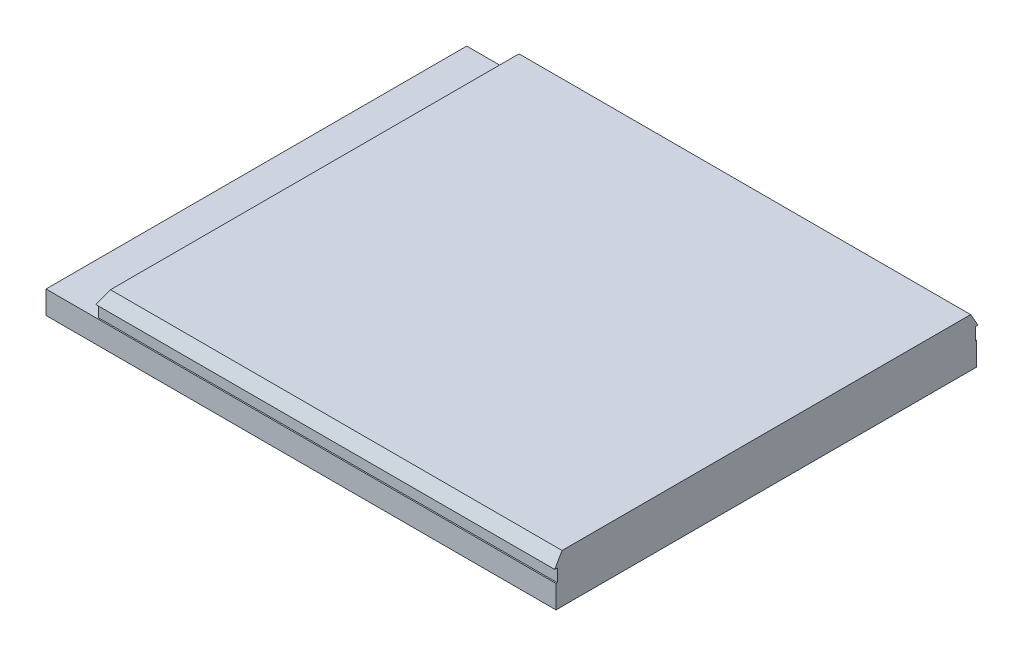
ISO-10303-21;
HEADER;
FILE_DESCRIPTION(('STEP AP214'),'2;1');
FILE_NAME('part.step','',(''),(''),'','','');
FILE_SCHEMA(('AUTOMOTIVE_DESIGN { 1 0 10303 214 1 1 1 1 }'));
ENDSEC;
DATA;
#1=APPLICATION_CONTEXT('core data for automotive mechanical design processes');
#2=APPLICATION_PROTOCOL_DEFINITION('international standard','automotive_design',2000,#1);
#3=PRODUCT_CONTEXT('',#1,'mechanical');
#4=PRODUCT('Part','Part','',(#3));
#5=PRODUCT_RELATED_PRODUCT_CATEGORY('part','',(#4));
#6=PRODUCT_DEFINITION_FORMATION('','',#4);
#7=PRODUCT_DEFINITION_CONTEXT('part definition',#1,'design');
#8=PRODUCT_DEFINITION('design','',#6,#7);
#9=PRODUCT_DEFINITION_SHAPE('','',#8);
#10=(LENGTH_UNIT() NAMED_UNIT(*) SI_UNIT(.MILLI.,.METRE.));
#11=(NAMED_UNIT(*) PLANE_ANGLE_UNIT() SI_UNIT($,.RADIAN.));
#12=(NAMED_UNIT(*) SI_UNIT($,.STERADIAN.) SOLID_ANGLE_UNIT());
#13=UNCERTAINTY_MEASURE_WITH_UNIT(LENGTH_MEASURE(1.E-05),#10,'distance_accuracy_value','');
#14=(GEOMETRIC_REPRESENTATION_CONTEXT(3) GLOBAL_UNCERTAINTY_ASSIGNED_CONTEXT((#13)) GLOBAL_UNIT_ASSIGNED_CONTEXT((#10,
#11,#12)) REPRESENTATION_CONTEXT('',''));
#15=CARTESIAN_POINT('',(0.,0.,0.));
#16=DIRECTION('',(0.,0.,1.));
#17=DIRECTION('',(1.,0.,0.));
#18=AXIS2_PLACEMENT_3D('',#15,#16,#17);
#19=CARTESIAN_POINT('',(-7.15383369720603,-16.2258305231151,4.44835605739227));
#20=DIRECTION('',(0.,1.,0.));
#21=DIRECTION('',(0.,0.,1.));
#22=AXIS2_PLACEMENT_3D('',#19,#20,#21);
#23=PLANE('',#22);
#24=DIRECTION('',(0.,0.,-1.));
#25=VECTOR('',#24,1.);
#26=CARTESIAN_POINT('',(-7.15383369720603,-16.2258305231151,25.1637386364569));
#27=LINE('',#26,#25);
#28=CARTESIAN_POINT('',(-7.15383369720603,-16.2258305231151,24.7971212155214));
#29=VERTEX_POINT('',#28);
#30=CARTESIAN_POINT('',(-7.15383369720603,-16.2258305231151,4.44835605739227));
#31=VERTEX_POINT('',#30);
#32=EDGE_CURVE('E221',#29,#31,#27,.T.);
#33=ORIENTED_EDGE('',*,*,#32,.T.);
#34=DIRECTION('',(-1.,0.,0.));
#35=VECTOR('',#34,1.);
#36=CARTESIAN_POINT('',(-30.013833697206,-16.2258305231151,4.44835605739227));
#37=LINE('',#36,#35);
#38=CARTESIAN_POINT('',(-29.6472162762706,-16.2258305231151,4.44835605739227));
#39=VERTEX_POINT('',#38);
#40=EDGE_CURVE('E187',#31,#39,#37,.T.);
#41=ORIENTED_EDGE('',*,*,#40,.T.);
#42=DIRECTION('',(0.,0.,1.));
#43=VECTOR('',#42,1.);
#44=CARTESIAN_POINT('',(-29.6472162762706,-16.2258305231151,25.1637386364569));
#45=LINE('',#44,#43);
#46=CARTESIAN_POINT('',(-29.6472162762706,-16.2258305231151,24.7971212155214));
#47=VERTEX_POINT('',#46);
#48=EDGE_CURVE('E203',#39,#47,#45,.T.);
#49=ORIENTED_EDGE('',*,*,#48,.T.);
#50=DIRECTION('',(1.,0.,0.));
#51=VECTOR('',#50,1.);
#52=CARTESIAN_POINT('',(-17.2852523703531,-16.2258305231151,24.7971212155214));
#53=LINE('',#52,#51);
#54=EDGE_CURVE('E89',#47,#29,#53,.T.);
#55=ORIENTED_EDGE('',*,*,#54,.T.);
#56=EDGE_LOOP('',(#33,#41,#49,#55));
#57=FACE_BOUND('',#56,.T.);
#58=ADVANCED_FACE('F49',(#57),#23,.T.);
#59=CARTESIAN_POINT('',(-32.553833697206,-17.4958305231151,25.1002386364569));
#60=DIRECTION('',(1.,0.,0.));
#61=DIRECTION('',(0.,1.,0.));
#62=AXIS2_PLACEMENT_3D('',#59,#60,#61);
#63=PLANE('',#62);
#64=DIRECTION('',(0.,-1.,0.));
#65=VECTOR('',#64,1.);
#66=CARTESIAN_POINT('',(-32.553833697206,-17.4958305231151,4.14523863645686));
#67=LINE('',#66,#65);
#68=CARTESIAN_POINT('',(-32.553833697206,-17.4958305231151,4.14523863645686));
#69=VERTEX_POINT('',#68);
#70=CARTESIAN_POINT('',(-32.553833697206,-18.6388305231151,4.14523863645686));
#71=VERTEX_POINT('',#70);
#72=EDGE_CURVE('E255',#69,#71,#67,.T.);
#73=ORIENTED_EDGE('',*,*,#72,.T.);
#74=DIRECTION('',(0.,0.,-1.));
#75=VECTOR('',#74,1.);
#76=CARTESIAN_POINT('',(-32.553833697206,-18.6388305231151,25.1002386364569));
#77=LINE('',#76,#75);
#78=CARTESIAN_POINT('',(-32.553833697206,-18.6388305231151,25.1002386364569));
#79=VERTEX_POINT('',#78);
#80=EDGE_CURVE('E285',#79,#71,#77,.T.);
#81=ORIENTED_EDGE('',*,*,#80,.F.);
#82=DIRECTION('',(0.,-1.,0.));
#83=VECTOR('',#82,1.);
#84=CARTESIAN_POINT('',(-32.553833697206,-17.4958305231151,25.1002386364569));
#85=LINE('',#84,#83);
#86=CARTESIAN_POINT('',(-32.553833697206,-17.4958305231151,25.1002386364569));
#87=VERTEX_POINT('',#86);
#88=EDGE_CURVE('E269',#87,#79,#85,.T.);
#89=ORIENTED_EDGE('',*,*,#88,.F.);
#90=DIRECTION('',(0.,0.,-1.));
#91=VECTOR('',#90,1.);
#92=CARTESIAN_POINT('',(-32.553833697206,-17.4958305231151,25.1002386364569));
#93=LINE('',#92,#91);
#94=EDGE_CURVE('E248',#87,#69,#93,.T.);
#95=ORIENTED_EDGE('',*,*,#94,.T.);
#96=EDGE_LOOP('',(#73,#81,#89,#95));
#97=FACE_BOUND('',#96,.T.);
#98=ADVANCED_FACE('F293',(#97),#63,.F.);
#99=CARTESIAN_POINT('',(-7.15383369720603,-18.6388305231151,25.1002386364569));
#100=DIRECTION('',(0.,-1.,0.));
#101=DIRECTION('',(1.,0.,0.));
#102=AXIS2_PLACEMENT_3D('',#99,#100,#101);
#103=PLANE('',#102);
#104=DIRECTION('',(-1.,0.,0.));
#105=VECTOR('',#104,1.);
#106=CARTESIAN_POINT('',(-7.15383369720603,-18.6388305231151,4.14523863645686));
#107=LINE('',#106,#105);
#108=CARTESIAN_POINT('',(-7.15383369720603,-18.6388305231151,4.14523863645686));
#109=VERTEX_POINT('',#108);
#110=EDGE_CURVE('E260',#109,#71,#107,.T.);
#111=ORIENTED_EDGE('',*,*,#110,.F.);
#112=DIRECTION('',(0.,0.,-1.));
#113=VECTOR('',#112,1.);
#114=CARTESIAN_POINT('',(-7.15383369720603,-18.6388305231151,25.1002386364569));
#115=LINE('',#114,#113);
#116=CARTESIAN_POINT('',(-7.15383369720603,-18.6388305231151,25.1002386364569));
#117=VERTEX_POINT('',#116);
#118=EDGE_CURVE('E270',#117,#109,#115,.T.);
#119=ORIENTED_EDGE('',*,*,#118,.F.);
#120=DIRECTION('',(-1.,0.,0.));
#121=VECTOR('',#120,1.);
#122=CARTESIAN_POINT('',(-7.15383369720603,-18.6388305231151,25.1002386364569));
#123=LINE('',#122,#121);
#124=EDGE_CURVE('E273',#117,#79,#123,.T.);
#125=ORIENTED_EDGE('',*,*,#124,.T.);
#126=ORIENTED_EDGE('',*,*,#80,.T.);
#127=EDGE_LOOP('',(#111,#119,#125,#126));
#128=FACE_BOUND('',#127,.T.);
#129=ADVANCED_FACE('F284',(#128),#103,.T.);
#130=CARTESIAN_POINT('',(-17.2852523703531,-8.09783052311507,25.1002386364569));
#131=DIRECTION('',(0.,0.,-1.));
#132=DIRECTION('',(-1.,0.,0.));
#133=AXIS2_PLACEMENT_3D('',#130,#131,#132);
#134=PLANE('',#133);
#135=DIRECTION('',(0.,-1.,0.));
#136=VECTOR('',#135,1.);
#137=CARTESIAN_POINT('',(-7.15383369720603,-17.4958305231151,25.1002386364569));
#138=LINE('',#137,#136);
#139=CARTESIAN_POINT('',(-7.15383369720603,-17.4958305231151,25.1002386364569));
#140=VERTEX_POINT('',#139);
#141=EDGE_CURVE('E256',#140,#117,#138,.T.);
#142=ORIENTED_EDGE('',*,*,#141,.F.);
#143=DIRECTION('',(-1.,0.,0.));
#144=VECTOR('',#143,1.);
#145=CARTESIAN_POINT('',(-7.15383369720603,-17.4958305231151,25.1002386364569));
#146=LINE('',#145,#144);
#147=EDGE_CURVE('E242',#140,#87,#146,.T.);
#148=ORIENTED_EDGE('',*,*,#147,.T.);
#149=ORIENTED_EDGE('',*,*,#88,.T.);
#150=ORIENTED_EDGE('',*,*,#124,.F.);
#151=EDGE_LOOP('',(#142,#148,#149,#150));
#152=FACE_BOUND('',#151,.T.);
#153=ADVANCED_FACE('F280',(#152),#134,.F.);
#154=CARTESIAN_POINT('',(-17.2852523703531,-8.09783052311507,25.0367386364569));
#155=DIRECTION('',(0.,0.,1.));
#156=DIRECTION('',(1.,0.,0.));
#157=AXIS2_PLACEMENT_3D('',#154,#155,#156);
#158=PLANE('',#157);
#159=DIRECTION('',(1.,0.,0.));
#160=VECTOR('',#159,1.);
#161=CARTESIAN_POINT('',(-17.2852523703531,-16.8608305231151,25.0367386364569));
#162=LINE('',#161,#160);
#163=CARTESIAN_POINT('',(-30.013833697206,-16.8608305231151,25.0367386364569));
#164=VERTEX_POINT('',#163);
#165=CARTESIAN_POINT('',(-7.15383369720603,-16.8608305231151,25.0367386364569));
#166=VERTEX_POINT('',#165);
#167=EDGE_CURVE('E184',#164,#166,#162,.T.);
#168=ORIENTED_EDGE('',*,*,#167,.F.);
#169=DIRECTION('',(0.,-1.,0.));
#170=VECTOR('',#169,1.);
#171=CARTESIAN_POINT('',(-30.013833697206,-8.09783052311508,25.0367386364569));
#172=LINE('',#171,#170);
#173=CARTESIAN_POINT('',(-30.013833697206,-17.4958305231151,25.0367386364569));
#174=VERTEX_POINT('',#173);
#175=EDGE_CURVE('E191',#164,#174,#172,.T.);
#176=ORIENTED_EDGE('',*,*,#175,.T.);
#177=DIRECTION('',(-1.,0.,0.));
#178=VECTOR('',#177,1.);
#179=CARTESIAN_POINT('',(-17.2852523703531,-17.4958305231151,25.0367386364569));
#180=LINE('',#179,#178);
#181=CARTESIAN_POINT('',(-7.15383369720603,-17.4958305231151,25.0367386364569));
#182=VERTEX_POINT('',#181);
#183=EDGE_CURVE('E171',#182,#174,#180,.T.);
#184=ORIENTED_EDGE('',*,*,#183,.F.);
#185=DIRECTION('',(0.,-1.,0.));
#186=VECTOR('',#185,1.);
#187=CARTESIAN_POINT('',(-7.15383369720603,-8.09783052311507,25.0367386364569));
#188=LINE('',#187,#186);
#189=EDGE_CURVE('E173',#166,#182,#188,.T.);
#190=ORIENTED_EDGE('',*,*,#189,.F.);
#191=EDGE_LOOP('',(#168,#176,#184,#190));
#192=FACE_BOUND('',#191,.T.);
#193=ADVANCED_FACE('F342',(#192),#158,.T.);
#194=CARTESIAN_POINT('',(-17.2852523703531,-8.09783052311507,4.20873863645685));
#195=DIRECTION('',(0.,0.,1.));
#196=DIRECTION('',(1.,0.,0.));
#197=AXIS2_PLACEMENT_3D('',#194,#195,#196);
#198=PLANE('',#197);
#199=DIRECTION('',(1.,0.,0.));
#200=VECTOR('',#199,1.);
#201=CARTESIAN_POINT('',(-17.2852523703531,-16.8608305231151,4.20873863645685));
#202=LINE('',#201,#200);
#203=CARTESIAN_POINT('',(-30.013833697206,-16.8608305231151,4.20873863645685));
#204=VERTEX_POINT('',#203);
#205=CARTESIAN_POINT('',(-7.15383369720603,-16.8608305231151,4.20873863645685));
#206=VERTEX_POINT('',#205);
#207=EDGE_CURVE('E167',#204,#206,#202,.T.);
#208=ORIENTED_EDGE('',*,*,#207,.T.);
#209=DIRECTION('',(0.,-1.,0.));
#210=VECTOR('',#209,1.);
#211=CARTESIAN_POINT('',(-7.15383369720603,-8.09783052311507,4.20873863645685));
#212=LINE('',#211,#210);
#213=CARTESIAN_POINT('',(-7.15383369720603,-17.4958305231151,4.20873863645685));
#214=VERTEX_POINT('',#213);
#215=EDGE_CURVE('E153',#206,#214,#212,.T.);
#216=ORIENTED_EDGE('',*,*,#215,.T.);
#217=DIRECTION('',(-1.,0.,0.));
#218=VECTOR('',#217,1.);
#219=CARTESIAN_POINT('',(-17.2852523703531,-17.4958305231151,4.20873863645685));
#220=LINE('',#219,#218);
#221=CARTESIAN_POINT('',(-30.013833697206,-17.4958305231151,4.20873863645685));
#222=VERTEX_POINT('',#221);
#223=EDGE_CURVE('E148',#214,#222,#220,.T.);
#224=ORIENTED_EDGE('',*,*,#223,.T.);
#225=DIRECTION('',(0.,-1.,0.));
#226=VECTOR('',#225,1.);
#227=CARTESIAN_POINT('',(-30.013833697206,-8.09783052311508,4.20873863645685));
#228=LINE('',#227,#226);
#229=EDGE_CURVE('E151',#204,#222,#228,.T.);
#230=ORIENTED_EDGE('',*,*,#229,.F.);
#231=EDGE_LOOP('',(#208,#216,#224,#230));
#232=FACE_BOUND('',#231,.T.);
#233=ADVANCED_FACE('F150',(#232),#198,.F.);
#234=CARTESIAN_POINT('',(-7.15383369720603,-17.4958305231151,25.1002386364569));
#235=DIRECTION('',(0.,-1.,0.));
#236=DIRECTION('',(1.,0.,0.));
#237=AXIS2_PLACEMENT_3D('',#234,#235,#236);
#238=PLANE('',#237);
#239=ORIENTED_EDGE('',*,*,#223,.F.);
#240=DIRECTION('',(0.,0.,-1.));
#241=VECTOR('',#240,1.);
#242=CARTESIAN_POINT('',(-7.15383369720603,-17.4958305231151,25.1002386364569));
#243=LINE('',#242,#241);
#244=CARTESIAN_POINT('',(-7.15383369720603,-17.4958305231151,4.14523863645686));
#245=VERTEX_POINT('',#244);
#246=EDGE_CURVE('E245',#214,#245,#243,.T.);
#247=ORIENTED_EDGE('',*,*,#246,.T.);
#248=DIRECTION('',(-1.,0.,0.));
#249=VECTOR('',#248,1.);
#250=CARTESIAN_POINT('',(-7.15383369720603,-17.4958305231151,4.14523863645686));
#251=LINE('',#250,#249);
#252=EDGE_CURVE('E252',#245,#69,#251,.T.);
#253=ORIENTED_EDGE('',*,*,#252,.T.);
#254=ORIENTED_EDGE('',*,*,#94,.F.);
#255=ORIENTED_EDGE('',*,*,#147,.F.);
#256=EDGE_CURVE('E238',#140,#182,#243,.T.);
#257=ORIENTED_EDGE('',*,*,#256,.T.);
#258=ORIENTED_EDGE('',*,*,#183,.T.);
#259=DIRECTION('',(0.,0.,-1.));
#260=VECTOR('',#259,1.);
#261=CARTESIAN_POINT('',(-30.013833697206,-17.4958305231151,25.0367386364569));
#262=LINE('',#261,#260);
#263=EDGE_CURVE('E162',#174,#222,#262,.T.);
#264=ORIENTED_EDGE('',*,*,#263,.T.);
#265=EDGE_LOOP('',(#239,#247,#253,#254,#255,#257,#258,#264));
#266=FACE_BOUND('',#265,.T.);
#267=ADVANCED_FACE('F169',(#266),#238,.F.);
#268=CARTESIAN_POINT('',(-17.2852523703531,-8.09783052311507,4.14523863645686));
#269=DIRECTION('',(0.,0.,-1.));
#270=DIRECTION('',(-1.,0.,0.));
#271=AXIS2_PLACEMENT_3D('',#268,#269,#270);
#272=PLANE('',#271);
#273=DIRECTION('',(0.,-1.,0.));
#274=VECTOR('',#273,1.);
#275=CARTESIAN_POINT('',(-7.15383369720603,-17.4958305231151,4.14523863645686));
#276=LINE('',#275,#274);
#277=EDGE_CURVE('E179',#245,#109,#276,.T.);
#278=ORIENTED_EDGE('',*,*,#277,.T.);
#279=ORIENTED_EDGE('',*,*,#110,.T.);
#280=ORIENTED_EDGE('',*,*,#72,.F.);
#281=ORIENTED_EDGE('',*,*,#252,.F.);
#282=EDGE_LOOP('',(#278,#279,#280,#281));
#283=FACE_BOUND('',#282,.T.);
#284=ADVANCED_FACE('F296',(#283),#272,.T.);
#285=CARTESIAN_POINT('',(-17.2852523703531,-16.8608305231151,25.1637386364569));
#286=DIRECTION('',(0.,1.,0.));
#287=DIRECTION('',(-1.,0.,0.));
#288=AXIS2_PLACEMENT_3D('',#285,#286,#287);
#289=PLANE('',#288);
#290=DIRECTION('',(0.,0.,-1.));
#291=VECTOR('',#290,1.);
#292=CARTESIAN_POINT('',(-30.013833697206,-16.8608305231151,25.1637386364569));
#293=LINE('',#292,#291);
#294=CARTESIAN_POINT('',(-30.013833697206,-16.8608305231151,25.1637386364569));
#295=VERTEX_POINT('',#294);
#296=EDGE_CURVE('E213',#295,#164,#293,.T.);
#297=ORIENTED_EDGE('',*,*,#296,.T.);
#298=ORIENTED_EDGE('',*,*,#167,.T.);
#299=DIRECTION('',(0.,0.,-1.));
#300=VECTOR('',#299,1.);
#301=CARTESIAN_POINT('',(-7.15383369720603,-16.8608305231151,25.1637386364569));
#302=LINE('',#301,#300);
#303=CARTESIAN_POINT('',(-7.15383369720603,-16.8608305231151,25.1637386364569));
#304=VERTEX_POINT('',#303);
#305=EDGE_CURVE('E217',#304,#166,#302,.T.);
#306=ORIENTED_EDGE('',*,*,#305,.F.);
#307=DIRECTION('',(1.,0.,0.));
#308=VECTOR('',#307,1.);
#309=CARTESIAN_POINT('',(-17.2852523703531,-16.8608305231151,25.1637386364569));
#310=LINE('',#309,#308);
#311=EDGE_CURVE('E52',#295,#304,#310,.T.);
#312=ORIENTED_EDGE('',*,*,#311,.F.);
#313=EDGE_LOOP('',(#297,#298,#306,#312));
#314=FACE_BOUND('',#313,.T.);
#315=ADVANCED_FACE('F233',(#314),#289,.F.);
#316=CARTESIAN_POINT('',(-30.013833697206,-8.09783052311508,25.0367386364569));
#317=DIRECTION('',(1.,0.,0.));
#318=DIRECTION('',(0.,1.,0.));
#319=AXIS2_PLACEMENT_3D('',#316,#317,#318);
#320=PLANE('',#319);
#321=ORIENTED_EDGE('',*,*,#229,.T.);
#322=ORIENTED_EDGE('',*,*,#263,.F.);
#323=ORIENTED_EDGE('',*,*,#175,.F.);
#324=DIRECTION('',(0.,0.,-1.));
#325=VECTOR('',#324,1.);
#326=CARTESIAN_POINT('',(-30.013833697206,-16.8608305231151,25.0367386364569));
#327=LINE('',#326,#325);
#328=EDGE_CURVE('E165',#164,#204,#327,.T.);
#329=ORIENTED_EDGE('',*,*,#328,.T.);
#330=EDGE_LOOP('',(#321,#322,#323,#329));
#331=FACE_BOUND('',#330,.T.);
#332=ADVANCED_FACE('F161',(#331),#320,.F.);
#333=CARTESIAN_POINT('',(-17.2852523703531,-16.2258305231151,24.7971212155214));
#334=DIRECTION('',(0.,-0.5,-0.866025403784439));
#335=DIRECTION('',(1.,0.,0.));
#336=AXIS2_PLACEMENT_3D('',#333,#334,#335);
#337=PLANE('',#336);
#338=DIRECTION('',(0.,0.866025403784439,-0.5));
#339=VECTOR('',#338,1.);
#340=CARTESIAN_POINT('',(-7.15383369720603,-10.2885805231151,21.3692483297753));
#341=LINE('',#340,#339);
#342=EDGE_CURVE('E80',#29,#304,#341,.F.);
#343=ORIENTED_EDGE('',*,*,#342,.F.);
#344=ORIENTED_EDGE('',*,*,#54,.F.);
#345=DIRECTION('',(0.447213595499958,0.774596669241483,-0.447213595499958));
#346=VECTOR('',#345,1.);
#347=CARTESIAN_POINT('',(-27.1748234950871,-11.9435206098387,22.3247284343379));
#348=LINE('',#347,#346);
#349=EDGE_CURVE('E59',#295,#47,#348,.T.);
#350=ORIENTED_EDGE('',*,*,#349,.F.);
#351=ORIENTED_EDGE('',*,*,#311,.T.);
#352=EDGE_LOOP('',(#343,#344,#350,#351));
#353=FACE_BOUND('',#352,.T.);
#354=ADVANCED_FACE('F230',(#353),#337,.F.);
#355=ORIENTED_EDGE('',*,*,#207,.F.);
#356=CARTESIAN_POINT('',(-30.013833697206,-16.8608305231151,4.08173863645686));
#357=VERTEX_POINT('',#356);
#358=EDGE_CURVE('E68',#204,#357,#293,.T.);
#359=ORIENTED_EDGE('',*,*,#358,.T.);
#360=DIRECTION('',(1.,0.,0.));
#361=VECTOR('',#360,1.);
#362=CARTESIAN_POINT('',(-17.2852523703531,-16.8608305231151,4.08173863645686));
#363=LINE('',#362,#361);
#364=CARTESIAN_POINT('',(-7.15383369720603,-16.8608305231151,4.08173863645686));
#365=VERTEX_POINT('',#364);
#366=EDGE_CURVE('E199',#357,#365,#363,.T.);
#367=ORIENTED_EDGE('',*,*,#366,.T.);
#368=EDGE_CURVE('E220',#206,#365,#302,.T.);
#369=ORIENTED_EDGE('',*,*,#368,.F.);
#370=EDGE_LOOP('',(#355,#359,#367,#369));
#371=FACE_BOUND('',#370,.T.);
#372=ADVANCED_FACE('F298',(#371),#289,.F.);
#373=CARTESIAN_POINT('',(-7.15383369720603,-17.4958305231151,25.1002386364569));
#374=DIRECTION('',(1.,0.,0.));
#375=DIRECTION('',(0.,1.,0.));
#376=AXIS2_PLACEMENT_3D('',#373,#374,#375);
#377=PLANE('',#376);
#378=ORIENTED_EDGE('',*,*,#277,.F.);
#379=ORIENTED_EDGE('',*,*,#246,.F.);
#380=ORIENTED_EDGE('',*,*,#215,.F.);
#381=ORIENTED_EDGE('',*,*,#368,.T.);
#382=DIRECTION('',(0.,0.866025403784439,0.5));
#383=VECTOR('',#382,1.);
#384=CARTESIAN_POINT('',(-7.15383369720603,-1.1598067418233,13.1467289431384));
#385=LINE('',#384,#383);
#386=EDGE_CURVE('E208',#365,#31,#385,.T.);
#387=ORIENTED_EDGE('',*,*,#386,.T.);
#388=ORIENTED_EDGE('',*,*,#32,.F.);
#389=ORIENTED_EDGE('',*,*,#342,.T.);
#390=ORIENTED_EDGE('',*,*,#305,.T.);
#391=ORIENTED_EDGE('',*,*,#189,.T.);
#392=ORIENTED_EDGE('',*,*,#256,.F.);
#393=ORIENTED_EDGE('',*,*,#141,.T.);
#394=ORIENTED_EDGE('',*,*,#118,.T.);
#395=EDGE_LOOP('',(#378,#379,#380,#381,#387,#388,#389,#390,#391,#392,#393,#394));
#396=FACE_BOUND('',#395,.T.);
#397=ADVANCED_FACE('F236',(#396),#377,.T.);
#398=CARTESIAN_POINT('',(-30.013833697206,-16.8608305231151,25.1637386364569));
#399=DIRECTION('',(-0.866025403784439,0.5,0.));
#400=DIRECTION('',(0.,0.,1.));
#401=AXIS2_PLACEMENT_3D('',#398,#399,#400);
#402=PLANE('',#401);
#403=ORIENTED_EDGE('',*,*,#349,.T.);
#404=ORIENTED_EDGE('',*,*,#48,.F.);
#405=DIRECTION('',(-0.447213595499958,-0.774596669241483,-0.447213595499958));
#406=VECTOR('',#405,1.);
#407=CARTESIAN_POINT('',(-25.797433697206,-9.55781149808166,8.29813863645686));
#408=LINE('',#407,#406);
#409=EDGE_CURVE('E11',#357,#39,#408,.F.);
#410=ORIENTED_EDGE('',*,*,#409,.F.);
#411=ORIENTED_EDGE('',*,*,#358,.F.);
#412=ORIENTED_EDGE('',*,*,#328,.F.);
#413=ORIENTED_EDGE('',*,*,#296,.F.);
#414=EDGE_LOOP('',(#403,#404,#410,#411,#412,#413));
#415=FACE_BOUND('',#414,.T.);
#416=ADVANCED_FACE('F302',(#415),#402,.T.);
#417=CARTESIAN_POINT('',(-17.2852523703531,-16.8608305231151,4.08173863645686));
#418=DIRECTION('',(0.,0.5,-0.866025403784439));
#419=DIRECTION('',(-1.,0.,0.));
#420=AXIS2_PLACEMENT_3D('',#417,#418,#419);
#421=PLANE('',#420);
#422=ORIENTED_EDGE('',*,*,#409,.T.);
#423=ORIENTED_EDGE('',*,*,#40,.F.);
#424=ORIENTED_EDGE('',*,*,#386,.F.);
#425=ORIENTED_EDGE('',*,*,#366,.F.);
#426=EDGE_LOOP('',(#422,#423,#424,#425));
#427=FACE_BOUND('',#426,.T.);
#428=ADVANCED_FACE('F306',(#427),#421,.T.);
#429=CLOSED_SHELL('',(#58,#98,#129,#153,#193,#233,#267,#284,#315,#332,#354,#372,#397,#416,#428));
#430=MANIFOLD_SOLID_BREP('B2',#429);
#431=ADVANCED_BREP_SHAPE_REPRESENTATION('',(#18,#430),#14);
#432=SHAPE_DEFINITION_REPRESENTATION(#9,#431);
ENDSEC;
END-ISO-10303-21;
